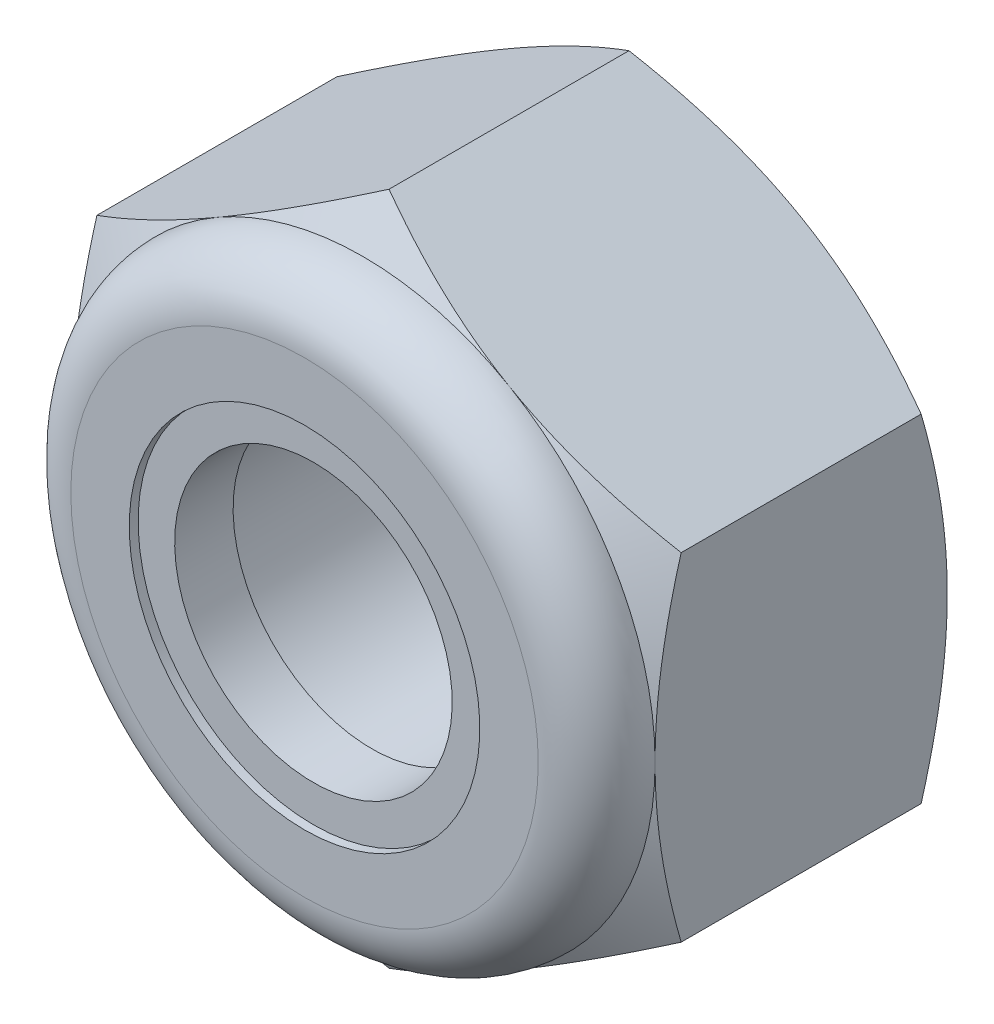
ISO-10303-21;
HEADER;
FILE_DESCRIPTION(('STEP AP214'),'2;1');
FILE_NAME('part.step','',(''),(''),'','','');
FILE_SCHEMA(('AUTOMOTIVE_DESIGN { 1 0 10303 214 1 1 1 1 }'));
ENDSEC;
DATA;
#1=APPLICATION_CONTEXT('core data for automotive mechanical design processes');
#2=APPLICATION_PROTOCOL_DEFINITION('international standard','automotive_design',2000,#1);
#3=PRODUCT_CONTEXT('',#1,'mechanical');
#4=PRODUCT('Part','Part','',(#3));
#5=PRODUCT_RELATED_PRODUCT_CATEGORY('part','',(#4));
#6=PRODUCT_DEFINITION_FORMATION('','',#4);
#7=PRODUCT_DEFINITION_CONTEXT('part definition',#1,'design');
#8=PRODUCT_DEFINITION('design','',#6,#7);
#9=PRODUCT_DEFINITION_SHAPE('','',#8);
#10=(LENGTH_UNIT() NAMED_UNIT(*) SI_UNIT(.MILLI.,.METRE.));
#11=(NAMED_UNIT(*) PLANE_ANGLE_UNIT() SI_UNIT($,.RADIAN.));
#12=(NAMED_UNIT(*) SI_UNIT($,.STERADIAN.) SOLID_ANGLE_UNIT());
#13=UNCERTAINTY_MEASURE_WITH_UNIT(LENGTH_MEASURE(1.E-05),#10,'distance_accuracy_value','');
#14=(GEOMETRIC_REPRESENTATION_CONTEXT(3) GLOBAL_UNCERTAINTY_ASSIGNED_CONTEXT((#13)) GLOBAL_UNIT_ASSIGNED_CONTEXT((#10,
#11,#12)) REPRESENTATION_CONTEXT('',''));
#15=CARTESIAN_POINT('',(0.,0.,0.));
#16=DIRECTION('',(0.,0.,1.));
#17=DIRECTION('',(1.,0.,0.));
#18=AXIS2_PLACEMENT_3D('',#15,#16,#17);
#19=CARTESIAN_POINT('',(0.,0.,5.8476));
#20=DIRECTION('',(0.,0.,1.));
#21=DIRECTION('',(0.,-1.,0.));
#22=AXIS2_PLACEMENT_3D('',#19,#20,#21);
#23=PLANE('',#22);
#24=CARTESIAN_POINT('',(0.,0.,5.8476));
#25=DIRECTION('',(0.,0.,1.));
#26=DIRECTION('',(0.,-1.,0.));
#27=AXIS2_PLACEMENT_3D('',#24,#25,#26);
#28=CIRCLE('',#27,2.375);
#29=CARTESIAN_POINT('',(0.,2.375,5.8476));
#30=VERTEX_POINT('',#29);
#31=EDGE_CURVE('P0_E58',#30,#30,#28,.T.);
#32=ORIENTED_EDGE('',*,*,#31,.F.);
#33=EDGE_LOOP('',(#32));
#34=FACE_BOUND('',#33,.T.);
#35=CARTESIAN_POINT('',(0.,0.,5.8476));
#36=DIRECTION('',(0.,0.,1.));
#37=DIRECTION('',(0.,-1.,0.));
#38=AXIS2_PLACEMENT_3D('',#35,#36,#37);
#39=CIRCLE('',#38,3.);
#40=CARTESIAN_POINT('',(0.,3.,5.8476));
#41=VERTEX_POINT('',#40);
#42=EDGE_CURVE('P0_E80',#41,#41,#39,.T.);
#43=ORIENTED_EDGE('',*,*,#42,.T.);
#44=EDGE_LOOP('',(#43));
#45=FACE_BOUND('',#44,.T.);
#46=ADVANCED_FACE('P0_F17',(#34,#45),#23,.T.);
#47=CARTESIAN_POINT('',(0.,0.,4.8476));
#48=DIRECTION('',(0.,0.,1.));
#49=DIRECTION('',(0.,-1.,0.));
#50=AXIS2_PLACEMENT_3D('',#47,#48,#49);
#51=PLANE('',#50);
#52=CARTESIAN_POINT('',(0.,0.,4.8476));
#53=DIRECTION('',(0.,0.,1.));
#54=DIRECTION('',(0.,-1.,0.));
#55=AXIS2_PLACEMENT_3D('',#52,#53,#54);
#56=CIRCLE('',#55,2.375);
#57=CARTESIAN_POINT('',(0.,2.375,4.8476));
#58=VERTEX_POINT('',#57);
#59=EDGE_CURVE('P0_E21',#58,#58,#56,.T.);
#60=ORIENTED_EDGE('',*,*,#59,.T.);
#61=EDGE_LOOP('',(#60));
#62=FACE_BOUND('',#61,.T.);
#63=CARTESIAN_POINT('',(0.,0.,4.8476));
#64=DIRECTION('',(0.,0.,1.));
#65=DIRECTION('',(0.,-1.,0.));
#66=AXIS2_PLACEMENT_3D('',#63,#64,#65);
#67=CIRCLE('',#66,3.);
#68=CARTESIAN_POINT('',(0.,3.,4.8476));
#69=VERTEX_POINT('',#68);
#70=EDGE_CURVE('P0_E11',#69,#69,#67,.T.);
#71=ORIENTED_EDGE('',*,*,#70,.F.);
#72=EDGE_LOOP('',(#71));
#73=FACE_BOUND('',#72,.T.);
#74=ADVANCED_FACE('P0_F62',(#62,#73),#51,.F.);
#75=CARTESIAN_POINT('',(0.,0.,4.8476));
#76=DIRECTION('',(0.,0.,1.));
#77=DIRECTION('',(0.,-1.,0.));
#78=AXIS2_PLACEMENT_3D('',#75,#76,#77);
#79=CYLINDRICAL_SURFACE('',#78,3.);
#80=ORIENTED_EDGE('',*,*,#42,.F.);
#81=DIRECTION('',(0.,0.,-1.));
#82=VECTOR('',#81,1.);
#83=CARTESIAN_POINT('',(0.,3.,4.8476));
#84=LINE('',#83,#82);
#85=EDGE_CURVE('P0_E27',#41,#69,#84,.T.);
#86=ORIENTED_EDGE('',*,*,#85,.T.);
#87=ORIENTED_EDGE('',*,*,#70,.T.);
#88=ORIENTED_EDGE('',*,*,#85,.F.);
#89=EDGE_LOOP('',(#80,#86,#87,#88));
#90=FACE_BOUND('',#89,.T.);
#91=ADVANCED_FACE('P0_F97',(#90),#79,.T.);
#92=CARTESIAN_POINT('',(0.,0.,4.8476));
#93=DIRECTION('',(0.,0.,1.));
#94=DIRECTION('',(0.,-1.,0.));
#95=AXIS2_PLACEMENT_3D('',#92,#93,#94);
#96=CYLINDRICAL_SURFACE('',#95,2.375);
#97=ORIENTED_EDGE('',*,*,#59,.F.);
#98=DIRECTION('',(0.,0.,1.));
#99=VECTOR('',#98,1.);
#100=CARTESIAN_POINT('',(0.,2.375,4.8476));
#101=LINE('',#100,#99);
#102=EDGE_CURVE('P0_E55',#58,#30,#101,.T.);
#103=ORIENTED_EDGE('',*,*,#102,.T.);
#104=ORIENTED_EDGE('',*,*,#31,.T.);
#105=ORIENTED_EDGE('',*,*,#102,.F.);
#106=EDGE_LOOP('',(#97,#103,#104,#105));
#107=FACE_BOUND('',#106,.T.);
#108=ADVANCED_FACE('P0_F19',(#107),#96,.F.);
#109=CLOSED_SHELL('',(#46,#74,#91,#108));
#110=MANIFOLD_SOLID_BREP('P0_B1',#109);
#111=CARTESIAN_POINT('',(0.,0.,0.));
#112=DIRECTION('',(0.,0.,1.));
#113=DIRECTION('',(0.,1.,0.));
#114=AXIS2_PLACEMENT_3D('',#111,#112,#113);
#115=CONICAL_SURFACE('',#114,5.,1.0471975511966);
#116=CARTESIAN_POINT('',(5.00000000002788,-2.88675134593203,0.446581987394495));
#117=CARTESIAN_POINT('',(3.66025403785559,-3.66025403783792,0.));
#118=CARTESIAN_POINT('',(2.5,-4.3301270189222,0.));
#119=(BOUNDED_CURVE() B_SPLINE_CURVE(2,(#116,#117,#118),.UNSPECIFIED.,.F.,
.F.) B_SPLINE_CURVE_WITH_KNOTS((3,3),(0.983556361086798,1.57455723444445),
.UNSPECIFIED.) CURVE() GEOMETRIC_REPRESENTATION_ITEM() RATIONAL_B_SPLINE_CURVE((1.89282032302473,
2.03923048454133,2.03923048454133)) REPRESENTATION_ITEM(''));
#120=CARTESIAN_POINT('',(5.,-2.88675134594813,0.4465819873852));
#121=VERTEX_POINT('',#120);
#122=CARTESIAN_POINT('',(2.5,-4.3301270189222,0.));
#123=VERTEX_POINT('',#122);
#124=EDGE_CURVE('P1_E258',#121,#123,#119,.T.);
#125=ORIENTED_EDGE('',*,*,#124,.T.);
#126=CARTESIAN_POINT('',(0.,0.,0.));
#127=DIRECTION('',(0.,0.,1.));
#128=DIRECTION('',(0.,-1.,0.));
#129=AXIS2_PLACEMENT_3D('',#126,#127,#128);
#130=CIRCLE('',#129,5.);
#131=CARTESIAN_POINT('',(5.,0.,0.));
#132=VERTEX_POINT('',#131);
#133=EDGE_CURVE('P1_E251',#123,#132,#130,.T.);
#134=ORIENTED_EDGE('',*,*,#133,.T.);
#135=CARTESIAN_POINT('',(5.,0.,0.));
#136=CARTESIAN_POINT('',(5.,-1.33974596216855,0.));
#137=CARTESIAN_POINT('',(5.,-2.88675134598032,0.446581987394493));
#138=(BOUNDED_CURVE() B_SPLINE_CURVE(2,(#135,#136,#137),.UNSPECIFIED.,.F.,
.F.) B_SPLINE_CURVE_WITH_KNOTS((3,3),(1.57455723444445,2.1655581078021),
.UNSPECIFIED.) CURVE() GEOMETRIC_REPRESENTATION_ITEM() RATIONAL_B_SPLINE_CURVE((2.03923048454134,
2.03923048454134,1.89282032302473)) REPRESENTATION_ITEM(''));
#139=EDGE_CURVE('P1_E321',#132,#121,#138,.T.);
#140=ORIENTED_EDGE('',*,*,#139,.T.);
#141=EDGE_LOOP('',(#125,#134,#140));
#142=FACE_BOUND('',#141,.T.);
#143=ADVANCED_FACE('P1_F17',(#142),#115,.T.);
#144=CARTESIAN_POINT('',(0.,0.,0.));
#145=DIRECTION('',(0.,0.,1.));
#146=DIRECTION('',(0.,1.,0.));
#147=AXIS2_PLACEMENT_3D('',#144,#145,#146);
#148=CONICAL_SURFACE('',#147,5.,1.0471975511966);
#149=CARTESIAN_POINT('',(2.5,4.3301270189222,0.));
#150=CARTESIAN_POINT('',(3.66025403785544,3.66025403783801,0.));
#151=CARTESIAN_POINT('',(5.0000000000275,2.88675134593225,0.446581987394372));
#152=(BOUNDED_CURVE() B_SPLINE_CURVE(2,(#149,#150,#151),.UNSPECIFIED.,.F.,
.F.) B_SPLINE_CURVE_WITH_KNOTS((3,3),(1.57455723444445,2.16555810780202),
.UNSPECIFIED.) CURVE() GEOMETRIC_REPRESENTATION_ITEM() RATIONAL_B_SPLINE_CURVE((2.03923048454133,
2.03923048454133,1.89282032302477)) REPRESENTATION_ITEM(''));
#153=CARTESIAN_POINT('',(2.5,4.3301270189222,0.));
#154=VERTEX_POINT('',#153);
#155=CARTESIAN_POINT('',(5.,2.88675134594882,0.446581987384743));
#156=VERTEX_POINT('',#155);
#157=EDGE_CURVE('P1_E368',#154,#156,#152,.T.);
#158=ORIENTED_EDGE('',*,*,#157,.T.);
#159=CARTESIAN_POINT('',(5.,2.88675134598085,0.446581987394647));
#160=CARTESIAN_POINT('',(5.,1.33974596216876,0.));
#161=CARTESIAN_POINT('',(4.99999999999999,0.,0.));
#162=(BOUNDED_CURVE() B_SPLINE_CURVE(2,(#159,#160,#161),.UNSPECIFIED.,.F.,
.F.) B_SPLINE_CURVE_WITH_KNOTS((3,3),(0.983556361086705,1.57455723444445),
.UNSPECIFIED.) CURVE() GEOMETRIC_REPRESENTATION_ITEM() RATIONAL_B_SPLINE_CURVE((1.89282032302468,
2.03923048454134,2.03923048454133)) REPRESENTATION_ITEM(''));
#163=EDGE_CURVE('P1_E257',#156,#132,#162,.T.);
#164=ORIENTED_EDGE('',*,*,#163,.T.);
#165=CARTESIAN_POINT('',(0.,0.,0.));
#166=DIRECTION('',(0.,0.,-1.));
#167=DIRECTION('',(0.,1.,0.));
#168=AXIS2_PLACEMENT_3D('',#165,#166,#167);
#169=CIRCLE('',#168,5.);
#170=EDGE_CURVE('P1_E11',#154,#132,#169,.T.);
#171=ORIENTED_EDGE('',*,*,#170,.F.);
#172=EDGE_LOOP('',(#158,#164,#171));
#173=FACE_BOUND('',#172,.T.);
#174=ADVANCED_FACE('P1_F505',(#173),#148,.T.);
#175=CARTESIAN_POINT('',(0.,0.,0.));
#176=DIRECTION('',(0.,0.,1.));
#177=DIRECTION('',(0.,1.,0.));
#178=AXIS2_PLACEMENT_3D('',#175,#176,#177);
#179=CONICAL_SURFACE('',#178,5.,1.0471975511966);
#180=CARTESIAN_POINT('',(-5.,0.,0.));
#181=CARTESIAN_POINT('',(-5.,1.33974596216856,0.));
#182=CARTESIAN_POINT('',(-5.,2.88675134598033,0.446581987394498));
#183=(BOUNDED_CURVE() B_SPLINE_CURVE(2,(#180,#181,#182),.UNSPECIFIED.,.F.,
.F.) B_SPLINE_CURVE_WITH_KNOTS((3,3),(1.57455723444445,2.1655581078021),
.UNSPECIFIED.) CURVE() GEOMETRIC_REPRESENTATION_ITEM() RATIONAL_B_SPLINE_CURVE((2.03923048454134,
2.03923048454134,1.89282032302473)) REPRESENTATION_ITEM(''));
#184=CARTESIAN_POINT('',(-5.,0.,0.));
#185=VERTEX_POINT('',#184);
#186=CARTESIAN_POINT('',(-5.,2.88675134594813,0.446581987385203));
#187=VERTEX_POINT('',#186);
#188=EDGE_CURVE('P1_E226',#185,#187,#183,.T.);
#189=ORIENTED_EDGE('',*,*,#188,.T.);
#190=CARTESIAN_POINT('',(-5.00000000002789,2.88675134593203,0.446581987394499));
#191=CARTESIAN_POINT('',(-3.6602540378556,3.66025403783792,0.));
#192=CARTESIAN_POINT('',(-2.5,4.3301270189222,0.));
#193=(BOUNDED_CURVE() B_SPLINE_CURVE(2,(#190,#191,#192),.UNSPECIFIED.,.F.,
.F.) B_SPLINE_CURVE_WITH_KNOTS((3,3),(0.983556361086797,1.57455723444445),
.UNSPECIFIED.) CURVE() GEOMETRIC_REPRESENTATION_ITEM() RATIONAL_B_SPLINE_CURVE((1.89282032302473,
2.03923048454133,2.03923048454133)) REPRESENTATION_ITEM(''));
#194=CARTESIAN_POINT('',(-2.5,4.3301270189222,0.));
#195=VERTEX_POINT('',#194);
#196=EDGE_CURVE('P1_E405',#187,#195,#193,.T.);
#197=ORIENTED_EDGE('',*,*,#196,.T.);
#198=CARTESIAN_POINT('',(0.,0.,0.));
#199=DIRECTION('',(0.,0.,1.));
#200=DIRECTION('',(0.,-1.,0.));
#201=AXIS2_PLACEMENT_3D('',#198,#199,#200);
#202=CIRCLE('',#201,5.);
#203=EDGE_CURVE('P1_E28',#195,#185,#202,.T.);
#204=ORIENTED_EDGE('',*,*,#203,.T.);
#205=EDGE_LOOP('',(#189,#197,#204));
#206=FACE_BOUND('',#205,.T.);
#207=ADVANCED_FACE('P1_F502',(#206),#179,.T.);
#208=CARTESIAN_POINT('',(0.,0.,0.));
#209=DIRECTION('',(0.,0.,1.));
#210=DIRECTION('',(0.,1.,0.));
#211=AXIS2_PLACEMENT_3D('',#208,#209,#210);
#212=CONICAL_SURFACE('',#211,5.,1.0471975511966);
#213=CARTESIAN_POINT('',(-5.,-2.88675134598033,0.446581987394496));
#214=CARTESIAN_POINT('',(-4.99999999999999,-1.33974596216856,0.));
#215=CARTESIAN_POINT('',(-5.,0.,0.));
#216=(BOUNDED_CURVE() B_SPLINE_CURVE(2,(#213,#214,#215),.UNSPECIFIED.,.F.,
.F.) B_SPLINE_CURVE_WITH_KNOTS((3,3),(0.983556361086797,1.57455723444444),
.UNSPECIFIED.) CURVE() GEOMETRIC_REPRESENTATION_ITEM() RATIONAL_B_SPLINE_CURVE((1.89282032302473,
2.03923048454133,2.03923048454134)) REPRESENTATION_ITEM(''));
#217=CARTESIAN_POINT('',(-5.,-2.88675134594813,0.446581987385201));
#218=VERTEX_POINT('',#217);
#219=EDGE_CURVE('P1_E242',#218,#185,#216,.T.);
#220=ORIENTED_EDGE('',*,*,#219,.T.);
#221=CARTESIAN_POINT('',(0.,0.,0.));
#222=DIRECTION('',(0.,0.,1.));
#223=DIRECTION('',(0.,-1.,0.));
#224=AXIS2_PLACEMENT_3D('',#221,#222,#223);
#225=CIRCLE('',#224,5.);
#226=CARTESIAN_POINT('',(-2.5,-4.33012701892219,0.));
#227=VERTEX_POINT('',#226);
#228=EDGE_CURVE('P1_E250',#185,#227,#225,.T.);
#229=ORIENTED_EDGE('',*,*,#228,.T.);
#230=CARTESIAN_POINT('',(-2.49999999999999,-4.3301270189222,0.));
#231=CARTESIAN_POINT('',(-3.66025403785559,-3.66025403783792,0.));
#232=CARTESIAN_POINT('',(-5.00000000002788,-2.88675134593203,0.446581987394494));
#233=(BOUNDED_CURVE() B_SPLINE_CURVE(2,(#230,#231,#232),.UNSPECIFIED.,.F.,
.F.) B_SPLINE_CURVE_WITH_KNOTS((3,3),(1.57455723444445,2.1655581078021),
.UNSPECIFIED.) CURVE() GEOMETRIC_REPRESENTATION_ITEM() RATIONAL_B_SPLINE_CURVE((2.03923048454133,
2.03923048454134,1.89282032302473)) REPRESENTATION_ITEM(''));
#234=EDGE_CURVE('P1_E268',#227,#218,#233,.T.);
#235=ORIENTED_EDGE('',*,*,#234,.T.);
#236=EDGE_LOOP('',(#220,#229,#235));
#237=FACE_BOUND('',#236,.T.);
#238=ADVANCED_FACE('P1_F504',(#237),#212,.T.);
#239=CARTESIAN_POINT('',(0.,0.,0.));
#240=DIRECTION('',(0.,0.,1.));
#241=DIRECTION('',(0.,-1.,0.));
#242=AXIS2_PLACEMENT_3D('',#239,#240,#241);
#243=CONICAL_SURFACE('',#242,5.,1.0471975511966);
#244=CARTESIAN_POINT('',(2.78838481234812E-11,-5.77350269191236,0.446581987394494));
#245=CARTESIAN_POINT('',(-1.33974596214441,-5.00000000000647,0.));
#246=CARTESIAN_POINT('',(-2.5,-4.33012701892219,0.));
#247=(BOUNDED_CURVE() B_SPLINE_CURVE(2,(#244,#245,#246),.UNSPECIFIED.,.F.,
.F.) B_SPLINE_CURVE_WITH_KNOTS((3,3),(0.983556361086797,1.57455723444445),
.UNSPECIFIED.) CURVE() GEOMETRIC_REPRESENTATION_ITEM() RATIONAL_B_SPLINE_CURVE((1.89282032302473,
2.03923048454134,2.03923048454134)) REPRESENTATION_ITEM(''));
#248=CARTESIAN_POINT('',(0.,-5.77350269189626,0.446581987385198));
#249=VERTEX_POINT('',#248);
#250=EDGE_CURVE('P1_E180',#249,#227,#247,.T.);
#251=ORIENTED_EDGE('',*,*,#250,.T.);
#252=CARTESIAN_POINT('',(0.,0.,0.));
#253=DIRECTION('',(0.,0.,1.));
#254=DIRECTION('',(0.,-1.,0.));
#255=AXIS2_PLACEMENT_3D('',#252,#253,#254);
#256=CIRCLE('',#255,5.);
#257=EDGE_CURVE('P1_E244',#227,#123,#256,.T.);
#258=ORIENTED_EDGE('',*,*,#257,.T.);
#259=CARTESIAN_POINT('',(2.5,-4.3301270189222,0.));
#260=CARTESIAN_POINT('',(1.3397459621444,-5.00000000000647,0.));
#261=CARTESIAN_POINT('',(-2.78892443313E-11,-5.77350269191236,0.446581987394495));
#262=(BOUNDED_CURVE() B_SPLINE_CURVE(2,(#259,#260,#261),.UNSPECIFIED.,.F.,
.F.) B_SPLINE_CURVE_WITH_KNOTS((3,3),(1.57455723444445,2.1655581078021),
.UNSPECIFIED.) CURVE() GEOMETRIC_REPRESENTATION_ITEM() RATIONAL_B_SPLINE_CURVE((2.03923048454133,
2.03923048454133,1.89282032302473)) REPRESENTATION_ITEM(''));
#263=EDGE_CURVE('P1_E252',#123,#249,#262,.T.);
#264=ORIENTED_EDGE('',*,*,#263,.T.);
#265=EDGE_LOOP('',(#251,#258,#264));
#266=FACE_BOUND('',#265,.T.);
#267=ADVANCED_FACE('P1_F512',(#266),#243,.T.);
#268=CARTESIAN_POINT('',(0.,0.,5.));
#269=DIRECTION('',(0.,0.,-1.));
#270=DIRECTION('',(0.,-1.,0.));
#271=AXIS2_PLACEMENT_3D('',#268,#269,#270);
#272=CONICAL_SURFACE('',#271,5.,1.0471975511966);
#273=CARTESIAN_POINT('',(-2.5,4.3301270189222,4.99999999999999));
#274=CARTESIAN_POINT('',(-3.66025403785544,3.66025403783801,4.99999999999999));
#275=CARTESIAN_POINT('',(-5.0000000000275,2.88675134593225,4.55341801260563));
#276=(BOUNDED_CURVE() B_SPLINE_CURVE(2,(#273,#274,#275),.UNSPECIFIED.,.F.,
.F.) B_SPLINE_CURVE_WITH_KNOTS((3,3),(1.57455723444445,2.16555810780202),
.UNSPECIFIED.) CURVE() GEOMETRIC_REPRESENTATION_ITEM() RATIONAL_B_SPLINE_CURVE((2.03923048454133,
2.03923048454133,1.89282032302477)) REPRESENTATION_ITEM(''));
#277=CARTESIAN_POINT('',(-2.5,4.33012701892219,5.));
#278=VERTEX_POINT('',#277);
#279=CARTESIAN_POINT('',(-5.,2.88675134594882,4.55341801261526));
#280=VERTEX_POINT('',#279);
#281=EDGE_CURVE('P1_E243',#278,#280,#276,.T.);
#282=ORIENTED_EDGE('',*,*,#281,.T.);
#283=CARTESIAN_POINT('',(-5.,2.88675134598084,4.55341801260536));
#284=CARTESIAN_POINT('',(-5.,1.33974596216876,5.));
#285=CARTESIAN_POINT('',(-4.99999999999999,0.,4.99999999999999));
#286=(BOUNDED_CURVE() B_SPLINE_CURVE(2,(#283,#284,#285),.UNSPECIFIED.,.F.,
.F.) B_SPLINE_CURVE_WITH_KNOTS((3,3),(0.983556361086706,1.57455723444445),
.UNSPECIFIED.) CURVE() GEOMETRIC_REPRESENTATION_ITEM() RATIONAL_B_SPLINE_CURVE((1.89282032302468,
2.03923048454134,2.03923048454133)) REPRESENTATION_ITEM(''));
#287=CARTESIAN_POINT('',(-5.,0.,5.));
#288=VERTEX_POINT('',#287);
#289=EDGE_CURVE('P1_E136',#280,#288,#286,.T.);
#290=ORIENTED_EDGE('',*,*,#289,.T.);
#291=CARTESIAN_POINT('',(0.,0.,5.));
#292=DIRECTION('',(0.,0.,1.));
#293=DIRECTION('',(0.,-1.,0.));
#294=AXIS2_PLACEMENT_3D('',#291,#292,#293);
#295=CIRCLE('',#294,5.);
#296=EDGE_CURVE('P1_E284',#278,#288,#295,.T.);
#297=ORIENTED_EDGE('',*,*,#296,.F.);
#298=EDGE_LOOP('',(#282,#290,#297));
#299=FACE_BOUND('',#298,.T.);
#300=ADVANCED_FACE('P1_F533',(#299),#272,.T.);
#301=CARTESIAN_POINT('',(0.,0.,5.));
#302=DIRECTION('',(0.,0.,-1.));
#303=DIRECTION('',(0.,-1.,0.));
#304=AXIS2_PLACEMENT_3D('',#301,#302,#303);
#305=CONICAL_SURFACE('',#304,5.,1.0471975511966);
#306=CARTESIAN_POINT('',(-4.99999999999999,0.,4.99999999999999));
#307=CARTESIAN_POINT('',(-4.99999999999999,-1.33974596216856,4.99999999999999));
#308=CARTESIAN_POINT('',(-5.,-2.88675134598034,4.5534180126055));
#309=(BOUNDED_CURVE() B_SPLINE_CURVE(2,(#306,#307,#308),.UNSPECIFIED.,.F.,
.F.) B_SPLINE_CURVE_WITH_KNOTS((3,3),(1.57455723444445,2.1655581078021),
.UNSPECIFIED.) CURVE() GEOMETRIC_REPRESENTATION_ITEM() RATIONAL_B_SPLINE_CURVE((2.03923048454133,
2.03923048454133,1.89282032302473)) REPRESENTATION_ITEM(''));
#310=CARTESIAN_POINT('',(-5.,-2.88675134594813,4.5534180126148));
#311=VERTEX_POINT('',#310);
#312=EDGE_CURVE('P1_E227',#288,#311,#309,.T.);
#313=ORIENTED_EDGE('',*,*,#312,.T.);
#314=CARTESIAN_POINT('',(-5.00000000002789,-2.88675134593203,4.5534180126055));
#315=CARTESIAN_POINT('',(-3.6602540378556,-3.66025403783792,4.99999999999999));
#316=CARTESIAN_POINT('',(-2.5,-4.33012701892219,4.99999999999999));
#317=(BOUNDED_CURVE() B_SPLINE_CURVE(2,(#314,#315,#316),.UNSPECIFIED.,.F.,
.F.) B_SPLINE_CURVE_WITH_KNOTS((3,3),(0.983556361086796,1.57455723444445),
.UNSPECIFIED.) CURVE() GEOMETRIC_REPRESENTATION_ITEM() RATIONAL_B_SPLINE_CURVE((1.89282032302473,
2.03923048454133,2.03923048454133)) REPRESENTATION_ITEM(''));
#318=CARTESIAN_POINT('',(-2.5,-4.3301270189222,5.));
#319=VERTEX_POINT('',#318);
#320=EDGE_CURVE('P1_E184',#311,#319,#317,.T.);
#321=ORIENTED_EDGE('',*,*,#320,.T.);
#322=CARTESIAN_POINT('',(0.,0.,5.));
#323=DIRECTION('',(0.,0.,1.));
#324=DIRECTION('',(0.,-1.,0.));
#325=AXIS2_PLACEMENT_3D('',#322,#323,#324);
#326=CIRCLE('',#325,5.);
#327=EDGE_CURVE('P1_E291',#288,#319,#326,.T.);
#328=ORIENTED_EDGE('',*,*,#327,.F.);
#329=EDGE_LOOP('',(#313,#321,#328));
#330=FACE_BOUND('',#329,.T.);
#331=ADVANCED_FACE('P1_F536',(#330),#305,.T.);
#332=CARTESIAN_POINT('',(0.,0.,5.));
#333=DIRECTION('',(0.,0.,-1.));
#334=DIRECTION('',(0.,-1.,0.));
#335=AXIS2_PLACEMENT_3D('',#332,#333,#334);
#336=CONICAL_SURFACE('',#335,5.,1.0471975511966);
#337=CARTESIAN_POINT('',(2.50000000000001,-4.33012701892219,4.99999999999999));
#338=CARTESIAN_POINT('',(3.6602540378556,-3.66025403783792,4.99999999999999));
#339=CARTESIAN_POINT('',(5.00000000002789,-2.88675134593203,4.5534180126055));
#340=(BOUNDED_CURVE() B_SPLINE_CURVE(2,(#337,#338,#339),.UNSPECIFIED.,.F.,
.F.) B_SPLINE_CURVE_WITH_KNOTS((3,3),(1.57455723444445,2.1655581078021),
.UNSPECIFIED.) CURVE() GEOMETRIC_REPRESENTATION_ITEM() RATIONAL_B_SPLINE_CURVE((2.03923048454133,
2.03923048454133,1.89282032302473)) REPRESENTATION_ITEM(''));
#341=CARTESIAN_POINT('',(2.5,-4.3301270189222,5.));
#342=VERTEX_POINT('',#341);
#343=CARTESIAN_POINT('',(5.,-2.88675134594813,4.5534180126148));
#344=VERTEX_POINT('',#343);
#345=EDGE_CURVE('P1_E191',#342,#344,#340,.T.);
#346=ORIENTED_EDGE('',*,*,#345,.T.);
#347=CARTESIAN_POINT('',(5.,-2.88675134598033,4.5534180126055));
#348=CARTESIAN_POINT('',(4.99999999999999,-1.33974596216856,4.99999999999999));
#349=CARTESIAN_POINT('',(4.99999999999999,0.,4.99999999999999));
#350=(BOUNDED_CURVE() B_SPLINE_CURVE(2,(#347,#348,#349),.UNSPECIFIED.,.F.,
.F.) B_SPLINE_CURVE_WITH_KNOTS((3,3),(0.983556361086797,1.57455723444445),
.UNSPECIFIED.) CURVE() GEOMETRIC_REPRESENTATION_ITEM() RATIONAL_B_SPLINE_CURVE((1.89282032302473,
2.03923048454133,2.03923048454133)) REPRESENTATION_ITEM(''));
#351=CARTESIAN_POINT('',(5.,0.,5.));
#352=VERTEX_POINT('',#351);
#353=EDGE_CURVE('P1_E144',#344,#352,#350,.T.);
#354=ORIENTED_EDGE('',*,*,#353,.T.);
#355=CARTESIAN_POINT('',(0.,0.,5.));
#356=DIRECTION('',(0.,0.,1.));
#357=DIRECTION('',(0.,-1.,0.));
#358=AXIS2_PLACEMENT_3D('',#355,#356,#357);
#359=CIRCLE('',#358,5.);
#360=EDGE_CURVE('P1_E277',#342,#352,#359,.T.);
#361=ORIENTED_EDGE('',*,*,#360,.F.);
#362=EDGE_LOOP('',(#346,#354,#361));
#363=FACE_BOUND('',#362,.T.);
#364=ADVANCED_FACE('P1_F542',(#363),#336,.T.);
#365=CARTESIAN_POINT('',(0.,0.,5.));
#366=DIRECTION('',(0.,0.,-1.));
#367=DIRECTION('',(0.,-1.,0.));
#368=AXIS2_PLACEMENT_3D('',#365,#366,#367);
#369=CONICAL_SURFACE('',#368,5.,1.0471975511966);
#370=CARTESIAN_POINT('',(5.00000000002751,2.88675134593225,4.55341801260563));
#371=CARTESIAN_POINT('',(3.66025403785544,3.66025403783801,4.99999999999999));
#372=CARTESIAN_POINT('',(2.49999999999999,4.3301270189222,4.99999999999999));
#373=(BOUNDED_CURVE() B_SPLINE_CURVE(2,(#370,#371,#372),.UNSPECIFIED.,.F.,
.F.) B_SPLINE_CURVE_WITH_KNOTS((3,3),(0.983556361086876,1.57455723444445),
.UNSPECIFIED.) CURVE() GEOMETRIC_REPRESENTATION_ITEM() RATIONAL_B_SPLINE_CURVE((1.89282032302477,
2.03923048454133,2.03923048454133)) REPRESENTATION_ITEM(''));
#374=CARTESIAN_POINT('',(5.,2.88675134594882,4.55341801261526));
#375=VERTEX_POINT('',#374);
#376=CARTESIAN_POINT('',(2.5,4.33012701892219,5.));
#377=VERTEX_POINT('',#376);
#378=EDGE_CURVE('P1_E154',#375,#377,#373,.T.);
#379=ORIENTED_EDGE('',*,*,#378,.T.);
#380=CARTESIAN_POINT('',(0.,0.,5.));
#381=DIRECTION('',(0.,0.,1.));
#382=DIRECTION('',(0.,-1.,0.));
#383=AXIS2_PLACEMENT_3D('',#380,#381,#382);
#384=CIRCLE('',#383,5.);
#385=EDGE_CURVE('P1_E269',#352,#377,#384,.T.);
#386=ORIENTED_EDGE('',*,*,#385,.F.);
#387=CARTESIAN_POINT('',(5.,0.,5.));
#388=CARTESIAN_POINT('',(5.,1.33974596216876,5.));
#389=CARTESIAN_POINT('',(5.,2.88675134598086,4.55341801260535));
#390=(BOUNDED_CURVE() B_SPLINE_CURVE(2,(#387,#388,#389),.UNSPECIFIED.,.F.,
.F.) B_SPLINE_CURVE_WITH_KNOTS((3,3),(1.57455723444445,2.16555810780219),
.UNSPECIFIED.) CURVE() GEOMETRIC_REPRESENTATION_ITEM() RATIONAL_B_SPLINE_CURVE((2.03923048454134,
2.03923048454134,1.89282032302468)) REPRESENTATION_ITEM(''));
#391=EDGE_CURVE('P1_E283',#352,#375,#390,.T.);
#392=ORIENTED_EDGE('',*,*,#391,.T.);
#393=EDGE_LOOP('',(#379,#386,#392));
#394=FACE_BOUND('',#393,.T.);
#395=ADVANCED_FACE('P1_F531',(#394),#369,.T.);
#396=CARTESIAN_POINT('',(0.,0.,5.));
#397=DIRECTION('',(0.,0.,-1.));
#398=DIRECTION('',(0.,1.,0.));
#399=AXIS2_PLACEMENT_3D('',#396,#397,#398);
#400=CONICAL_SURFACE('',#399,5.,1.0471975511966);
#401=CARTESIAN_POINT('',(2.49999999999999,4.3301270189222,4.99999999999999));
#402=CARTESIAN_POINT('',(1.3397459621444,5.00000000000648,4.99999999999999));
#403=CARTESIAN_POINT('',(-2.78941713036562E-11,5.77350269191236,4.5534180126055));
#404=(BOUNDED_CURVE() B_SPLINE_CURVE(2,(#401,#402,#403),.UNSPECIFIED.,.F.,
.F.) B_SPLINE_CURVE_WITH_KNOTS((3,3),(1.57455723444445,2.1655581078021),
.UNSPECIFIED.) CURVE() GEOMETRIC_REPRESENTATION_ITEM() RATIONAL_B_SPLINE_CURVE((2.03923048454133,
2.03923048454133,1.89282032302473)) REPRESENTATION_ITEM(''));
#405=CARTESIAN_POINT('',(0.,5.77350269189626,4.5534180126148));
#406=VERTEX_POINT('',#405);
#407=EDGE_CURVE('P1_E329',#377,#406,#404,.T.);
#408=ORIENTED_EDGE('',*,*,#407,.T.);
#409=CARTESIAN_POINT('',(2.78831442702875E-11,5.77350269191236,4.5534180126055));
#410=CARTESIAN_POINT('',(-1.33974596214441,5.00000000000647,4.99999999999999));
#411=CARTESIAN_POINT('',(-2.5,4.3301270189222,4.99999999999999));
#412=(BOUNDED_CURVE() B_SPLINE_CURVE(2,(#409,#410,#411),.UNSPECIFIED.,.F.,
.F.) B_SPLINE_CURVE_WITH_KNOTS((3,3),(0.983556361086798,1.57455723444445),
.UNSPECIFIED.) CURVE() GEOMETRIC_REPRESENTATION_ITEM() RATIONAL_B_SPLINE_CURVE((1.89282032302473,
2.03923048454133,2.03923048454133)) REPRESENTATION_ITEM(''));
#413=EDGE_CURVE('P1_E237',#406,#278,#412,.T.);
#414=ORIENTED_EDGE('',*,*,#413,.T.);
#415=CARTESIAN_POINT('',(0.,0.,5.));
#416=DIRECTION('',(0.,0.,1.));
#417=DIRECTION('',(0.,-1.,0.));
#418=AXIS2_PLACEMENT_3D('',#415,#416,#417);
#419=CIRCLE('',#418,5.);
#420=CARTESIAN_POINT('',(0.,5.,5.));
#421=VERTEX_POINT('',#420);
#422=EDGE_CURVE('P1_E292',#421,#278,#419,.T.);
#423=ORIENTED_EDGE('',*,*,#422,.F.);
#424=CARTESIAN_POINT('',(0.,0.,5.));
#425=DIRECTION('',(0.,0.,1.));
#426=DIRECTION('',(0.,-1.,0.));
#427=AXIS2_PLACEMENT_3D('',#424,#425,#426);
#428=CIRCLE('',#427,5.);
#429=EDGE_CURVE('P1_E276',#377,#421,#428,.T.);
#430=ORIENTED_EDGE('',*,*,#429,.F.);
#431=EDGE_LOOP('',(#408,#414,#423,#430));
#432=FACE_BOUND('',#431,.T.);
#433=ADVANCED_FACE('P1_F527',(#432),#400,.T.);
#434=CARTESIAN_POINT('',(-5.,8.66025403784439,6.));
#435=DIRECTION('',(0.,0.,1.));
#436=DIRECTION('',(0.,-1.,0.));
#437=AXIS2_PLACEMENT_3D('',#434,#435,#436);
#438=PLANE('',#437);
#439=CARTESIAN_POINT('',(0.,0.,6.));
#440=DIRECTION('',(0.,0.,1.));
#441=DIRECTION('',(0.,-1.,0.));
#442=AXIS2_PLACEMENT_3D('',#439,#440,#441);
#443=CIRCLE('',#442,3.);
#444=CARTESIAN_POINT('',(0.,-3.,6.));
#445=VERTEX_POINT('',#444);
#446=EDGE_CURVE('P1_E228',#445,#445,#443,.T.);
#447=ORIENTED_EDGE('',*,*,#446,.F.);
#448=EDGE_LOOP('',(#447));
#449=FACE_BOUND('',#448,.T.);
#450=CARTESIAN_POINT('',(0.,0.,6.));
#451=DIRECTION('',(0.,0.,1.));
#452=DIRECTION('',(0.,-1.,0.));
#453=AXIS2_PLACEMENT_3D('',#450,#451,#452);
#454=CIRCLE('',#453,4.);
#455=CARTESIAN_POINT('',(0.,4.,6.));
#456=VERTEX_POINT('',#455);
#457=EDGE_CURVE('P1_E21',#456,#456,#454,.T.);
#458=ORIENTED_EDGE('',*,*,#457,.T.);
#459=EDGE_LOOP('',(#458));
#460=FACE_BOUND('',#459,.T.);
#461=ADVANCED_FACE('P1_F530',(#449,#460),#438,.T.);
#462=CARTESIAN_POINT('',(-5.,8.66025403784439,0.));
#463=DIRECTION('',(0.,0.,1.));
#464=DIRECTION('',(0.,-1.,0.));
#465=AXIS2_PLACEMENT_3D('',#462,#463,#464);
#466=PLANE('',#465);
#467=CARTESIAN_POINT('',(0.,0.,0.));
#468=DIRECTION('',(0.,0.,1.));
#469=DIRECTION('',(-1.,0.,0.));
#470=AXIS2_PLACEMENT_3D('',#467,#468,#469);
#471=CIRCLE('',#470,2.5175);
#472=CARTESIAN_POINT('',(2.5175,0.,0.));
#473=VERTEX_POINT('',#472);
#474=EDGE_CURVE('P1_E347',#473,#473,#471,.T.);
#475=ORIENTED_EDGE('',*,*,#474,.T.);
#476=EDGE_LOOP('',(#475));
#477=FACE_BOUND('',#476,.T.);
#478=ORIENTED_EDGE('',*,*,#133,.F.);
#479=ORIENTED_EDGE('',*,*,#257,.F.);
#480=ORIENTED_EDGE('',*,*,#228,.F.);
#481=ORIENTED_EDGE('',*,*,#203,.F.);
#482=CARTESIAN_POINT('',(0.,0.,0.));
#483=DIRECTION('',(0.,0.,1.));
#484=DIRECTION('',(0.,-1.,0.));
#485=AXIS2_PLACEMENT_3D('',#482,#483,#484);
#486=CIRCLE('',#485,5.);
#487=EDGE_CURVE('P1_E369',#154,#195,#486,.T.);
#488=ORIENTED_EDGE('',*,*,#487,.F.);
#489=ORIENTED_EDGE('',*,*,#170,.T.);
#490=EDGE_LOOP('',(#478,#479,#480,#481,#488,#489));
#491=FACE_BOUND('',#490,.T.);
#492=ADVANCED_FACE('P1_F450',(#477,#491),#466,.F.);
#493=CARTESIAN_POINT('',(5.,-2.88675134594813,6.));
#494=DIRECTION('',(-1.,0.,0.));
#495=DIRECTION('',(0.,0.,1.));
#496=AXIS2_PLACEMENT_3D('',#493,#494,#495);
#497=PLANE('',#496);
#498=ORIENTED_EDGE('',*,*,#163,.F.);
#499=DIRECTION('',(0.,0.,-1.));
#500=VECTOR('',#499,1.);
#501=CARTESIAN_POINT('',(5.,2.88675134594813,6.));
#502=LINE('',#501,#500);
#503=EDGE_CURVE('P1_E361',#375,#156,#502,.T.);
#504=ORIENTED_EDGE('',*,*,#503,.F.);
#505=ORIENTED_EDGE('',*,*,#391,.F.);
#506=ORIENTED_EDGE('',*,*,#353,.F.);
#507=DIRECTION('',(0.,0.,-1.));
#508=VECTOR('',#507,1.);
#509=CARTESIAN_POINT('',(5.,-2.88675134594813,6.));
#510=LINE('',#509,#508);
#511=EDGE_CURVE('P1_E267',#344,#121,#510,.T.);
#512=ORIENTED_EDGE('',*,*,#511,.T.);
#513=ORIENTED_EDGE('',*,*,#139,.F.);
#514=EDGE_LOOP('',(#498,#504,#505,#506,#512,#513));
#515=FACE_BOUND('',#514,.T.);
#516=ADVANCED_FACE('P1_F539',(#515),#497,.F.);
#517=CARTESIAN_POINT('',(0.,-5.77350269189626,6.));
#518=DIRECTION('',(-0.5,0.866025403784439,0.));
#519=DIRECTION('',(0.,0.,1.));
#520=AXIS2_PLACEMENT_3D('',#517,#518,#519);
#521=PLANE('',#520);
#522=ORIENTED_EDGE('',*,*,#124,.F.);
#523=ORIENTED_EDGE('',*,*,#511,.F.);
#524=ORIENTED_EDGE('',*,*,#345,.F.);
#525=CARTESIAN_POINT('',(-2.78803288575125E-11,-5.77350269191236,4.5534180126055));
#526=CARTESIAN_POINT('',(1.3397459621444,-5.00000000000647,4.99999999999999));
#527=CARTESIAN_POINT('',(2.49999999999999,-4.3301270189222,4.99999999999999));
#528=(BOUNDED_CURVE() B_SPLINE_CURVE(2,(#525,#526,#527),.UNSPECIFIED.,.F.,
.F.) B_SPLINE_CURVE_WITH_KNOTS((3,3),(-2.1655581078021,-1.57455723444445),
.UNSPECIFIED.) CURVE() GEOMETRIC_REPRESENTATION_ITEM() RATIONAL_B_SPLINE_CURVE((1.89282032302473,
2.03923048454133,2.03923048454133)) REPRESENTATION_ITEM(''));
#529=CARTESIAN_POINT('',(0.,-5.77350269189626,4.5534180126148));
#530=VERTEX_POINT('',#529);
#531=EDGE_CURVE('P1_E187',#530,#342,#528,.T.);
#532=ORIENTED_EDGE('',*,*,#531,.F.);
#533=DIRECTION('',(0.,0.,-1.));
#534=VECTOR('',#533,1.);
#535=CARTESIAN_POINT('',(0.,-5.77350269189626,6.));
#536=LINE('',#535,#534);
#537=EDGE_CURVE('P1_E172',#530,#249,#536,.T.);
#538=ORIENTED_EDGE('',*,*,#537,.T.);
#539=ORIENTED_EDGE('',*,*,#263,.F.);
#540=EDGE_LOOP('',(#522,#523,#524,#532,#538,#539));
#541=FACE_BOUND('',#540,.T.);
#542=ADVANCED_FACE('P1_F189',(#541),#521,.F.);
#543=CARTESIAN_POINT('',(-5.,-2.88675134594813,6.));
#544=DIRECTION('',(0.5,0.866025403784439,0.));
#545=DIRECTION('',(0.,0.,-1.));
#546=AXIS2_PLACEMENT_3D('',#543,#544,#545);
#547=PLANE('',#546);
#548=ORIENTED_EDGE('',*,*,#250,.F.);
#549=ORIENTED_EDGE('',*,*,#537,.F.);
#550=CARTESIAN_POINT('',(-2.5,-4.33012701892219,5.));
#551=CARTESIAN_POINT('',(-1.3397459621444,-5.00000000000647,5.));
#552=CARTESIAN_POINT('',(2.78915905086125E-11,-5.77350269191236,4.5534180126055));
#553=(BOUNDED_CURVE() B_SPLINE_CURVE(2,(#550,#551,#552),.UNSPECIFIED.,.F.,
.F.) B_SPLINE_CURVE_WITH_KNOTS((3,3),(1.57455723444445,2.1655581078021),
.UNSPECIFIED.) CURVE() GEOMETRIC_REPRESENTATION_ITEM() RATIONAL_B_SPLINE_CURVE((2.03923048454134,
2.03923048454134,1.89282032302473)) REPRESENTATION_ITEM(''));
#554=EDGE_CURVE('P1_E176',#319,#530,#553,.T.);
#555=ORIENTED_EDGE('',*,*,#554,.F.);
#556=ORIENTED_EDGE('',*,*,#320,.F.);
#557=DIRECTION('',(0.,0.,-1.));
#558=VECTOR('',#557,1.);
#559=CARTESIAN_POINT('',(-5.,-2.88675134594813,6.));
#560=LINE('',#559,#558);
#561=EDGE_CURVE('P1_E293',#311,#218,#560,.T.);
#562=ORIENTED_EDGE('',*,*,#561,.T.);
#563=ORIENTED_EDGE('',*,*,#234,.F.);
#564=EDGE_LOOP('',(#548,#549,#555,#556,#562,#563));
#565=FACE_BOUND('',#564,.T.);
#566=ADVANCED_FACE('P1_F174',(#565),#547,.F.);
#567=CARTESIAN_POINT('',(-5.,2.88675134594813,6.));
#568=DIRECTION('',(1.,0.,0.));
#569=DIRECTION('',(0.,1.,0.));
#570=AXIS2_PLACEMENT_3D('',#567,#568,#569);
#571=PLANE('',#570);
#572=ORIENTED_EDGE('',*,*,#219,.F.);
#573=ORIENTED_EDGE('',*,*,#561,.F.);
#574=ORIENTED_EDGE('',*,*,#312,.F.);
#575=ORIENTED_EDGE('',*,*,#289,.F.);
#576=DIRECTION('',(0.,0.,-1.));
#577=VECTOR('',#576,1.);
#578=CARTESIAN_POINT('',(-5.,2.88675134594813,6.));
#579=LINE('',#578,#577);
#580=EDGE_CURVE('P1_E360',#280,#187,#579,.T.);
#581=ORIENTED_EDGE('',*,*,#580,.T.);
#582=ORIENTED_EDGE('',*,*,#188,.F.);
#583=EDGE_LOOP('',(#572,#573,#574,#575,#581,#582));
#584=FACE_BOUND('',#583,.T.);
#585=ADVANCED_FACE('P1_F496',(#584),#571,.F.);
#586=CARTESIAN_POINT('',(0.,5.77350269189626,6.));
#587=DIRECTION('',(0.5,-0.866025403784439,0.));
#588=DIRECTION('',(0.,0.,-1.));
#589=AXIS2_PLACEMENT_3D('',#586,#587,#588);
#590=PLANE('',#589);
#591=ORIENTED_EDGE('',*,*,#196,.F.);
#592=ORIENTED_EDGE('',*,*,#580,.F.);
#593=ORIENTED_EDGE('',*,*,#281,.F.);
#594=ORIENTED_EDGE('',*,*,#413,.F.);
#595=DIRECTION('',(0.,0.,-1.));
#596=VECTOR('',#595,1.);
#597=CARTESIAN_POINT('',(0.,5.77350269189626,6.));
#598=LINE('',#597,#596);
#599=CARTESIAN_POINT('',(0.,5.77350269189626,0.446581987385204));
#600=VERTEX_POINT('',#599);
#601=EDGE_CURVE('P1_E338',#406,#600,#598,.T.);
#602=ORIENTED_EDGE('',*,*,#601,.T.);
#603=CARTESIAN_POINT('',(-2.5,4.3301270189222,0.));
#604=CARTESIAN_POINT('',(-1.3397459621444,5.00000000000647,0.));
#605=CARTESIAN_POINT('',(2.78878366249125E-11,5.77350269191236,0.4465819873945));
#606=(BOUNDED_CURVE() B_SPLINE_CURVE(2,(#603,#604,#605),.UNSPECIFIED.,.F.,
.F.) B_SPLINE_CURVE_WITH_KNOTS((3,3),(1.57455723444445,2.1655581078021),
.UNSPECIFIED.) CURVE() GEOMETRIC_REPRESENTATION_ITEM() RATIONAL_B_SPLINE_CURVE((2.03923048454133,
2.03923048454133,1.89282032302473)) REPRESENTATION_ITEM(''));
#607=EDGE_CURVE('P1_E209',#195,#600,#606,.T.);
#608=ORIENTED_EDGE('',*,*,#607,.F.);
#609=EDGE_LOOP('',(#591,#592,#593,#594,#602,#608));
#610=FACE_BOUND('',#609,.T.);
#611=ADVANCED_FACE('P1_F500',(#610),#590,.F.);
#612=CARTESIAN_POINT('',(5.,2.88675134594813,6.));
#613=DIRECTION('',(-0.5,-0.866025403784439,0.));
#614=DIRECTION('',(-0.866025403784439,0.5,0.));
#615=AXIS2_PLACEMENT_3D('',#612,#613,#614);
#616=PLANE('',#615);
#617=CARTESIAN_POINT('',(-2.78812673284375E-11,5.77350269191235,0.446581987394497));
#618=CARTESIAN_POINT('',(1.3397459621444,5.00000000000647,0.));
#619=CARTESIAN_POINT('',(2.49999999999999,4.3301270189222,0.));
#620=(BOUNDED_CURVE() B_SPLINE_CURVE(2,(#617,#618,#619),.UNSPECIFIED.,.F.,
.F.) B_SPLINE_CURVE_WITH_KNOTS((3,3),(-2.1655581078021,-1.57455723444445),
.UNSPECIFIED.) CURVE() GEOMETRIC_REPRESENTATION_ITEM() RATIONAL_B_SPLINE_CURVE((1.89282032302473,
2.03923048454133,2.03923048454133)) REPRESENTATION_ITEM(''));
#621=EDGE_CURVE('P1_E204',#600,#154,#620,.T.);
#622=ORIENTED_EDGE('',*,*,#621,.F.);
#623=ORIENTED_EDGE('',*,*,#601,.F.);
#624=ORIENTED_EDGE('',*,*,#407,.F.);
#625=ORIENTED_EDGE('',*,*,#378,.F.);
#626=ORIENTED_EDGE('',*,*,#503,.T.);
#627=ORIENTED_EDGE('',*,*,#157,.F.);
#628=EDGE_LOOP('',(#622,#623,#624,#625,#626,#627));
#629=FACE_BOUND('',#628,.T.);
#630=ADVANCED_FACE('P1_F19',(#629),#616,.F.);
#631=CARTESIAN_POINT('',(0.,0.,5.));
#632=DIRECTION('',(0.,0.,1.));
#633=DIRECTION('',(0.,-1.,0.));
#634=AXIS2_PLACEMENT_3D('',#631,#632,#633);
#635=TOROIDAL_SURFACE('',#634,4.,1.);
#636=ORIENTED_EDGE('',*,*,#457,.F.);
#637=CARTESIAN_POINT('',(0.,4.,5.));
#638=DIRECTION('',(-1.,0.,0.));
#639=DIRECTION('',(0.,1.,0.));
#640=AXIS2_PLACEMENT_3D('',#637,#638,#639);
#641=CIRCLE('',#640,1.);
#642=EDGE_CURVE('P1_E404',#456,#421,#641,.T.);
#643=ORIENTED_EDGE('',*,*,#642,.T.);
#644=ORIENTED_EDGE('',*,*,#422,.T.);
#645=ORIENTED_EDGE('',*,*,#296,.T.);
#646=ORIENTED_EDGE('',*,*,#327,.T.);
#647=CARTESIAN_POINT('',(0.,0.,5.));
#648=DIRECTION('',(0.,0.,1.));
#649=DIRECTION('',(0.,-1.,0.));
#650=AXIS2_PLACEMENT_3D('',#647,#648,#649);
#651=CIRCLE('',#650,5.);
#652=EDGE_CURVE('P1_E197',#319,#342,#651,.T.);
#653=ORIENTED_EDGE('',*,*,#652,.T.);
#654=ORIENTED_EDGE('',*,*,#360,.T.);
#655=ORIENTED_EDGE('',*,*,#385,.T.);
#656=ORIENTED_EDGE('',*,*,#429,.T.);
#657=ORIENTED_EDGE('',*,*,#642,.F.);
#658=EDGE_LOOP('',(#636,#643,#644,#645,#646,#653,#654,#655,#656,#657));
#659=FACE_BOUND('',#658,.T.);
#660=ADVANCED_FACE('P1_F525',(#659),#635,.T.);
#661=CARTESIAN_POINT('',(0.,0.,5.));
#662=DIRECTION('',(0.,0.,-1.));
#663=DIRECTION('',(0.,-1.,0.));
#664=AXIS2_PLACEMENT_3D('',#661,#662,#663);
#665=CONICAL_SURFACE('',#664,5.,1.0471975511966);
#666=ORIENTED_EDGE('',*,*,#652,.F.);
#667=ORIENTED_EDGE('',*,*,#554,.T.);
#668=ORIENTED_EDGE('',*,*,#531,.T.);
#669=EDGE_LOOP('',(#666,#667,#668));
#670=FACE_BOUND('',#669,.T.);
#671=ADVANCED_FACE('P1_F196',(#670),#665,.T.);
#672=CARTESIAN_POINT('',(0.,0.,0.));
#673=DIRECTION('',(0.,0.,1.));
#674=DIRECTION('',(0.,1.,0.));
#675=AXIS2_PLACEMENT_3D('',#672,#673,#674);
#676=CONICAL_SURFACE('',#675,5.,1.0471975511966);
#677=ORIENTED_EDGE('',*,*,#487,.T.);
#678=ORIENTED_EDGE('',*,*,#607,.T.);
#679=ORIENTED_EDGE('',*,*,#621,.T.);
#680=EDGE_LOOP('',(#677,#678,#679));
#681=FACE_BOUND('',#680,.T.);
#682=ADVANCED_FACE('P1_F552',(#681),#676,.T.);
#683=CARTESIAN_POINT('',(0.,0.,6.));
#684=DIRECTION('',(0.,0.,-1.));
#685=DIRECTION('',(0.,1.,0.));
#686=AXIS2_PLACEMENT_3D('',#683,#684,#685);
#687=CYLINDRICAL_SURFACE('',#686,3.);
#688=ORIENTED_EDGE('',*,*,#446,.T.);
#689=DIRECTION('',(0.,0.,-1.));
#690=VECTOR('',#689,1.);
#691=CARTESIAN_POINT('',(0.,-3.,6.));
#692=LINE('',#691,#690);
#693=CARTESIAN_POINT('',(0.,-3.,4.8476));
#694=VERTEX_POINT('',#693);
#695=EDGE_CURVE('P1_E235',#445,#694,#692,.T.);
#696=ORIENTED_EDGE('',*,*,#695,.T.);
#697=CARTESIAN_POINT('',(0.,0.,4.8476));
#698=DIRECTION('',(0.,0.,1.));
#699=DIRECTION('',(0.,-1.,0.));
#700=AXIS2_PLACEMENT_3D('',#697,#698,#699);
#701=CIRCLE('',#700,3.);
#702=EDGE_CURVE('P1_E236',#694,#694,#701,.T.);
#703=ORIENTED_EDGE('',*,*,#702,.F.);
#704=ORIENTED_EDGE('',*,*,#695,.F.);
#705=EDGE_LOOP('',(#688,#696,#703,#704));
#706=FACE_BOUND('',#705,.T.);
#707=ADVANCED_FACE('P1_F548',(#706),#687,.F.);
#708=CARTESIAN_POINT('',(0.,0.,4.8476));
#709=DIRECTION('',(0.,0.,-1.));
#710=DIRECTION('',(-1.,0.,0.));
#711=AXIS2_PLACEMENT_3D('',#708,#709,#710);
#712=PLANE('',#711);
#713=CARTESIAN_POINT('',(0.,0.,4.8476));
#714=DIRECTION('',(0.,0.,-1.));
#715=DIRECTION('',(-1.,0.,0.));
#716=AXIS2_PLACEMENT_3D('',#713,#714,#715);
#717=CIRCLE('',#716,2.5175);
#718=CARTESIAN_POINT('',(2.5175,0.,4.8476));
#719=VERTEX_POINT('',#718);
#720=EDGE_CURVE('P1_E346',#719,#719,#717,.T.);
#721=ORIENTED_EDGE('',*,*,#720,.T.);
#722=EDGE_LOOP('',(#721));
#723=FACE_BOUND('',#722,.T.);
#724=ORIENTED_EDGE('',*,*,#702,.T.);
#725=EDGE_LOOP('',(#724));
#726=FACE_BOUND('',#725,.T.);
#727=ADVANCED_FACE('P1_F551',(#723,#726),#712,.F.);
#728=CARTESIAN_POINT('',(0.,0.,2.66618));
#729=DIRECTION('',(0.,0.,1.));
#730=DIRECTION('',(-1.,0.,0.));
#731=AXIS2_PLACEMENT_3D('',#728,#729,#730);
#732=CYLINDRICAL_SURFACE('',#731,2.5175);
#733=ORIENTED_EDGE('',*,*,#474,.F.);
#734=DIRECTION('',(0.,0.,1.));
#735=VECTOR('',#734,1.);
#736=CARTESIAN_POINT('',(2.5175,0.,2.66618));
#737=LINE('',#736,#735);
#738=EDGE_CURVE('P1_E339',#473,#719,#737,.T.);
#739=ORIENTED_EDGE('',*,*,#738,.T.);
#740=ORIENTED_EDGE('',*,*,#720,.F.);
#741=ORIENTED_EDGE('',*,*,#738,.F.);
#742=EDGE_LOOP('',(#733,#739,#740,#741));
#743=FACE_BOUND('',#742,.T.);
#744=ADVANCED_FACE('P1_F452',(#743),#732,.F.);
#745=CLOSED_SHELL('',(#143,#174,#207,#238,#267,#300,#331,#364,#395,#433,#461,#492,#516,#542,
#566,#585,#611,#630,#660,#671,#682,#707,#727,#744));
#746=MANIFOLD_SOLID_BREP('P1_B1',#745);
#747=ADVANCED_BREP_SHAPE_REPRESENTATION('',(#18,#110,#746),#14);
#748=SHAPE_DEFINITION_REPRESENTATION(#9,#747);
ENDSEC;
END-ISO-10303-21;
